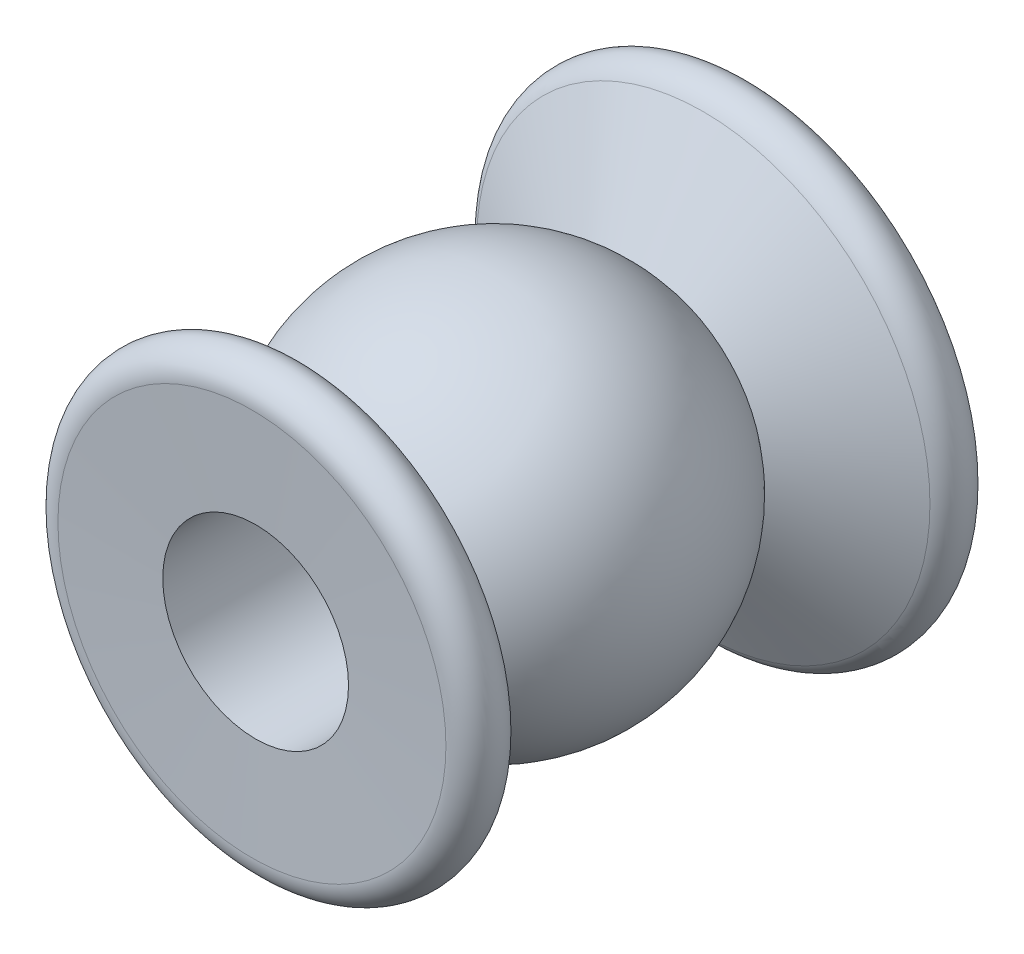
ISO-10303-21;
HEADER;
FILE_DESCRIPTION(('STEP AP214'),'2;1');
FILE_NAME('part.step','',(''),(''),'','','');
FILE_SCHEMA(('AUTOMOTIVE_DESIGN { 1 0 10303 214 1 1 1 1 }'));
ENDSEC;
DATA;
#1=APPLICATION_CONTEXT('core data for automotive mechanical design processes');
#2=APPLICATION_PROTOCOL_DEFINITION('international standard','automotive_design',2000,#1);
#3=PRODUCT_CONTEXT('',#1,'mechanical');
#4=PRODUCT('Part','Part','',(#3));
#5=PRODUCT_RELATED_PRODUCT_CATEGORY('part','',(#4));
#6=PRODUCT_DEFINITION_FORMATION('','',#4);
#7=PRODUCT_DEFINITION_CONTEXT('part definition',#1,'design');
#8=PRODUCT_DEFINITION('design','',#6,#7);
#9=PRODUCT_DEFINITION_SHAPE('','',#8);
#10=(LENGTH_UNIT() NAMED_UNIT(*) SI_UNIT(.MILLI.,.METRE.));
#11=(NAMED_UNIT(*) PLANE_ANGLE_UNIT() SI_UNIT($,.RADIAN.));
#12=(NAMED_UNIT(*) SI_UNIT($,.STERADIAN.) SOLID_ANGLE_UNIT());
#13=UNCERTAINTY_MEASURE_WITH_UNIT(LENGTH_MEASURE(1.E-05),#10,'distance_accuracy_value','');
#14=(GEOMETRIC_REPRESENTATION_CONTEXT(3) GLOBAL_UNCERTAINTY_ASSIGNED_CONTEXT((#13)) GLOBAL_UNIT_ASSIGNED_CONTEXT((#10,
#11,#12)) REPRESENTATION_CONTEXT('',''));
#15=CARTESIAN_POINT('',(0.,0.,0.));
#16=DIRECTION('',(0.,0.,1.));
#17=DIRECTION('',(1.,0.,0.));
#18=AXIS2_PLACEMENT_3D('',#15,#16,#17);
#19=CARTESIAN_POINT('',(0.,0.,-9.76374104308214));
#20=DIRECTION('',(0.,0.,-1.));
#21=DIRECTION('',(-1.,0.,0.));
#22=AXIS2_PLACEMENT_3D('',#19,#20,#21);
#23=CONICAL_SURFACE('',#22,7.9473037405945,1.45595489999742);
#24=CARTESIAN_POINT('',(0.,0.,-9.76374104308214));
#25=DIRECTION('',(0.,0.,1.));
#26=DIRECTION('',(1.,0.,0.));
#27=AXIS2_PLACEMENT_3D('',#24,#25,#26);
#28=CIRCLE('',#27,7.9473037405945);
#29=CARTESIAN_POINT('',(7.9473037405945,0.,-9.76374104308214));
#30=VERTEX_POINT('',#29);
#31=EDGE_CURVE('E12',#30,#30,#28,.T.);
#32=ORIENTED_EDGE('',*,*,#31,.F.);
#33=EDGE_LOOP('',(#32));
#34=FACE_BOUND('',#33,.T.);
#35=CARTESIAN_POINT('',(0.,0.,-9.25074914375167));
#36=DIRECTION('',(0.,0.,-1.));
#37=DIRECTION('',(-1.,0.,0.));
#38=AXIS2_PLACEMENT_3D('',#35,#36,#37);
#39=CIRCLE('',#38,3.5);
#40=CARTESIAN_POINT('',(-3.5,0.,-9.25074914375167));
#41=VERTEX_POINT('',#40);
#42=EDGE_CURVE('E76',#41,#41,#39,.F.);
#43=ORIENTED_EDGE('',*,*,#42,.T.);
#44=EDGE_LOOP('',(#43));
#45=FACE_BOUND('',#44,.T.);
#46=ADVANCED_FACE('F51',(#34,#45),#23,.F.);
#47=CARTESIAN_POINT('',(0.,0.,8.84702775380752));
#48=DIRECTION('',(0.,0.,1.));
#49=DIRECTION('',(1.,0.,0.));
#50=AXIS2_PLACEMENT_3D('',#47,#48,#49);
#51=CONICAL_SURFACE('',#50,0.,1.53417143502492);
#52=CARTESIAN_POINT('',(0.,0.,9.11489896326883));
#53=DIRECTION('',(0.,0.,1.));
#54=DIRECTION('',(1.,0.,0.));
#55=AXIS2_PLACEMENT_3D('',#52,#53,#54);
#56=CIRCLE('',#55,7.31064074752768);
#57=CARTESIAN_POINT('',(7.31064074752768,0.,9.11489896326883));
#58=VERTEX_POINT('',#57);
#59=EDGE_CURVE('E73',#58,#58,#56,.T.);
#60=ORIENTED_EDGE('',*,*,#59,.T.);
#61=EDGE_LOOP('',(#60));
#62=FACE_BOUND('',#61,.T.);
#63=CARTESIAN_POINT('',(0.,0.,8.97527222176769));
#64=DIRECTION('',(0.,0.,1.));
#65=DIRECTION('',(1.,0.,0.));
#66=AXIS2_PLACEMENT_3D('',#63,#64,#65);
#67=CIRCLE('',#66,3.5);
#68=CARTESIAN_POINT('',(3.5,0.,8.97527222176769));
#69=VERTEX_POINT('',#68);
#70=EDGE_CURVE('E54',#69,#69,#67,.F.);
#71=ORIENTED_EDGE('',*,*,#70,.T.);
#72=EDGE_LOOP('',(#71));
#73=FACE_BOUND('',#72,.T.);
#74=ADVANCED_FACE('F83',(#62,#73),#51,.F.);
#75=CARTESIAN_POINT('',(0.,0.,-8.77032807550783));
#76=DIRECTION('',(0.,0.,1.));
#77=DIRECTION('',(1.,0.,0.));
#78=AXIS2_PLACEMENT_3D('',#75,#76,#77);
#79=TOROIDAL_SURFACE('',#78,8.06189290175383,1.);
#80=ORIENTED_EDGE('',*,*,#31,.T.);
#81=EDGE_LOOP('',(#80));
#82=FACE_BOUND('',#81,.T.);
#83=CARTESIAN_POINT('',(0.,0.,-7.89325821524805));
#84=DIRECTION('',(0.,0.,1.));
#85=DIRECTION('',(1.,0.,0.));
#86=AXIS2_PLACEMENT_3D('',#83,#84,#85);
#87=CIRCLE('',#86,8.5422557440136);
#88=CARTESIAN_POINT('',(8.5422557440136,0.,-7.89325821524805));
#89=VERTEX_POINT('',#88);
#90=EDGE_CURVE('E58',#89,#89,#87,.T.);
#91=ORIENTED_EDGE('',*,*,#90,.F.);
#92=EDGE_LOOP('',(#91));
#93=FACE_BOUND('',#92,.T.);
#94=ADVANCED_FACE('F102',(#82,#93),#79,.T.);
#95=CARTESIAN_POINT('',(0.,0.,-5.66422685879253));
#96=DIRECTION('',(0.,0.,-1.));
#97=DIRECTION('',(-1.,0.,0.));
#98=AXIS2_PLACEMENT_3D('',#95,#96,#97);
#99=CONICAL_SURFACE('',#98,4.47238178972498,1.06972796299294);
#100=ORIENTED_EDGE('',*,*,#90,.T.);
#101=EDGE_LOOP('',(#100));
#102=FACE_BOUND('',#101,.T.);
#103=CARTESIAN_POINT('',(0.,0.,-5.66422685879253));
#104=DIRECTION('',(0.,0.,1.));
#105=DIRECTION('',(1.,0.,0.));
#106=AXIS2_PLACEMENT_3D('',#103,#104,#105);
#107=CIRCLE('',#106,4.47238178972498);
#108=CARTESIAN_POINT('',(4.47238178972498,0.,-5.66422685879253));
#109=VERTEX_POINT('',#108);
#110=EDGE_CURVE('E62',#109,#109,#107,.T.);
#111=ORIENTED_EDGE('',*,*,#110,.F.);
#112=EDGE_LOOP('',(#111));
#113=FACE_BOUND('',#112,.T.);
#114=ADVANCED_FACE('F107',(#102,#113),#99,.T.);
#115=CARTESIAN_POINT('',(0.,0.,0.));
#116=DIRECTION('',(0.,0.,1.));
#117=DIRECTION('',(1.,0.,0.));
#118=AXIS2_PLACEMENT_3D('',#115,#116,#117);
#119=SPHERICAL_SURFACE('',#118,7.21703989049044);
#120=CARTESIAN_POINT('',(0.,0.,5.66422685879253));
#121=DIRECTION('',(0.,0.,1.));
#122=DIRECTION('',(1.,0.,0.));
#123=AXIS2_PLACEMENT_3D('',#120,#121,#122);
#124=CIRCLE('',#123,4.47238178972498);
#125=CARTESIAN_POINT('',(4.47238178972498,0.,5.66422685879253));
#126=VERTEX_POINT('',#125);
#127=EDGE_CURVE('E67',#126,#126,#124,.T.);
#128=CARTESIAN_POINT('',(4.47238178972498,0.,-5.66422685879253));
#129=CARTESIAN_POINT('',(4.57887675765777,0.,-5.58014571803071));
#130=CARTESIAN_POINT('',(4.68299479389537,0.,-5.49305490580676));
#131=CARTESIAN_POINT('',(4.88615858956199,0.,-5.31314528887719));
#132=CARTESIAN_POINT('',(4.98520434899101,0.,-5.22032648417158));
#133=CARTESIAN_POINT('',(5.17790517762229,0.,-5.02925223272128));
#134=CARTESIAN_POINT('',(5.27156024682455,0.,-4.9309967859766));
#135=CARTESIAN_POINT('',(5.45318274860404,0.,-4.72936277284556));
#136=CARTESIAN_POINT('',(5.54115018118126,0.,-4.62598420645921));
#137=CARTESIAN_POINT('',(5.71111739401435,0.,-4.41443246203139));
#138=CARTESIAN_POINT('',(5.79311717427022,0.,-4.30625928398993));
#139=CARTESIAN_POINT('',(5.9508883565815,0.,-4.08546242344564));
#140=CARTESIAN_POINT('',(6.02665975863693,0.,-3.97283874094282));
#141=CARTESIAN_POINT('',(6.17173318419777,0.,-3.74349903911334));
#142=CARTESIAN_POINT('',(6.24103520770319,0.,-3.62678301978669));
#143=CARTESIAN_POINT('',(6.37294947325716,0.,-3.38962985234525));
#144=CARTESIAN_POINT('',(6.43556171530572,0.,-3.26919270423047));
#145=CARTESIAN_POINT('',(6.55389728519761,0.,-3.02498031515533));
#146=CARTESIAN_POINT('',(6.60962061304093,0.,-2.90120507419497));
#147=CARTESIAN_POINT('',(6.71400113282278,0.,-2.65071015362226));
#148=CARTESIAN_POINT('',(6.76265832476129,0.,-2.52399047400991));
#149=CARTESIAN_POINT('',(6.85275182368886,0.,-2.26800969431247));
#150=CARTESIAN_POINT('',(6.89418813067792,0.,-2.13874859422738));
#151=CARTESIAN_POINT('',(6.96970807602298,0.,-1.87809607460729));
#152=CARTESIAN_POINT('',(7.003791714379,0.,-1.7467046550723));
#153=CARTESIAN_POINT('',(7.06449792311366,0.,-1.48220937279186));
#154=CARTESIAN_POINT('',(7.0911204934923,0.,-1.34910551004641));
#155=CARTESIAN_POINT('',(7.1368198960586,0.,-1.08160866383488));
#156=CARTESIAN_POINT('',(7.15589672824624,0.,-0.947215680368793));
#157=CARTESIAN_POINT('',(7.18644398262165,0.,-0.677568015112783));
#158=CARTESIAN_POINT('',(7.1979144048094,0.,-0.542313333322862));
#159=CARTESIAN_POINT('',(7.2132123587438,0.,-0.271372434355294));
#160=CARTESIAN_POINT('',(7.21703989049044,0.,-0.135686217177646));
#161=CARTESIAN_POINT('',(7.21703989049044,0.,0.135686217177648));
#162=CARTESIAN_POINT('',(7.2132123587438,0.,0.271372434355295));
#163=CARTESIAN_POINT('',(7.1979144048094,0.,0.542313333322863));
#164=CARTESIAN_POINT('',(7.18644398262165,0.,0.677568015112785));
#165=CARTESIAN_POINT('',(7.15589672824624,0.,0.947215680368793));
#166=CARTESIAN_POINT('',(7.1368198960586,0.,1.08160866383488));
#167=CARTESIAN_POINT('',(7.0911204934923,0.,1.34910551004641));
#168=CARTESIAN_POINT('',(7.06449792311366,0.,1.48220937279186));
#169=CARTESIAN_POINT('',(7.003791714379,0.,1.7467046550723));
#170=CARTESIAN_POINT('',(6.96970807602298,0.,1.87809607460729));
#171=CARTESIAN_POINT('',(6.89418813067792,0.,2.13874859422738));
#172=CARTESIAN_POINT('',(6.85275182368886,0.,2.26800969431247));
#173=CARTESIAN_POINT('',(6.76265832476129,0.,2.52399047400991));
#174=CARTESIAN_POINT('',(6.71400113282277,0.,2.65071015362226));
#175=CARTESIAN_POINT('',(6.60962061304093,0.,2.90120507419497));
#176=CARTESIAN_POINT('',(6.55389728519761,0.,3.02498031515533));
#177=CARTESIAN_POINT('',(6.43556171530572,0.,3.26919270423047));
#178=CARTESIAN_POINT('',(6.37294947325716,0.,3.38962985234525));
#179=CARTESIAN_POINT('',(6.24103520770319,0.,3.62678301978669));
#180=CARTESIAN_POINT('',(6.17173318419777,0.,3.74349903911334));
#181=CARTESIAN_POINT('',(6.02665975863693,0.,3.97283874094282));
#182=CARTESIAN_POINT('',(5.9508883565815,0.,4.08546242344564));
#183=CARTESIAN_POINT('',(5.79311717427022,0.,4.30625928398993));
#184=CARTESIAN_POINT('',(5.71111739401435,0.,4.41443246203139));
#185=CARTESIAN_POINT('',(5.54115018118126,0.,4.62598420645921));
#186=CARTESIAN_POINT('',(5.45318274860403,0.,4.72936277284556));
#187=CARTESIAN_POINT('',(5.27156024682455,0.,4.9309967859766));
#188=CARTESIAN_POINT('',(5.17790517762229,0.,5.02925223272128));
#189=CARTESIAN_POINT('',(4.98520434899101,0.,5.22032648417158));
#190=CARTESIAN_POINT('',(4.88615858956199,0.,5.3131452888772));
#191=CARTESIAN_POINT('',(4.68299479389537,0.,5.49305490580676));
#192=CARTESIAN_POINT('',(4.57887675765777,0.,5.58014571803071));
#193=CARTESIAN_POINT('',(4.47238178972498,0.,5.66422685879253));
#194=B_SPLINE_CURVE_WITH_KNOTS('',3,(#128,#129,#130,#131,#132,#133,#134,#135,#136,#137,#138,
#139,#140,#141,#142,#143,#144,#145,#146,#147,#148,#149,#150,#151,#152,#153,#154,#155,#156,#157,
#158,#159,#160,#161,#162,#163,#164,#165,#166,#167,#168,#169,#170,#171,#172,#173,#174,#175,#176,
#177,#178,#179,#180,#181,#182,#183,#184,#185,#186,#187,#188,#189,#190,#191,#192,#193),
.UNSPECIFIED.,.F.,.F.,(4,2,2,2,2,2,2,2,2,2,2,2,2,2,2,2,2,2,2,2,2,2,2,2,2,2,2,2,2,2,2,2,4),(0.,
0.407004720344563,0.814009440689128,1.22101416103369,1.62801888137826,2.03502360172282,
2.44202832206739,2.84903304241195,3.25603776275651,3.66304248310108,4.07004720344564,
4.47705192379021,4.88405664413477,5.29106136447933,5.6980660848239,6.10507080516846,
6.51207552551303,6.91908024585759,7.32608496620215,7.73308968654672,8.14009440689128,
8.54709912723585,8.95410384758041,9.36110856792498,9.76811328826954,10.1751180086141,
10.5821227289587,10.9891274493032,11.3961321696478,11.8031368899924,12.2101416103369,
12.6171463306815,13.0241510510261),.UNSPECIFIED.);
#195=EDGE_CURVE('BSEAM111',#109,#126,#194,.T.);
#196=ORIENTED_EDGE('',*,*,#110,.T.);
#197=ORIENTED_EDGE('',*,*,#127,.F.);
#198=ORIENTED_EDGE('',*,*,#195,.T.);
#199=ORIENTED_EDGE('',*,*,#195,.F.);
#200=EDGE_LOOP('',(#196,#198,#197,#199));
#201=FACE_BOUND('',#200,.T.);
#202=ADVANCED_FACE('F111',(#201),#119,.T.);
#203=CARTESIAN_POINT('',(0.,0.,7.21004024211526));
#204=DIRECTION('',(0.,0.,1.));
#205=DIRECTION('',(1.,0.,0.));
#206=AXIS2_PLACEMENT_3D('',#203,#204,#205);
#207=CONICAL_SURFACE('',#206,7.77154110562706,1.13262566801202);
#208=ORIENTED_EDGE('',*,*,#127,.T.);
#209=EDGE_LOOP('',(#208));
#210=FACE_BOUND('',#209,.T.);
#211=CARTESIAN_POINT('',(0.,0.,7.21004024211526));
#212=DIRECTION('',(0.,0.,1.));
#213=DIRECTION('',(1.,0.,0.));
#214=AXIS2_PLACEMENT_3D('',#211,#212,#213);
#215=CIRCLE('',#214,7.77154110562706);
#216=CARTESIAN_POINT('',(7.77154110562706,0.,7.21004024211526));
#217=VERTEX_POINT('',#216);
#218=EDGE_CURVE('E70',#217,#217,#215,.T.);
#219=ORIENTED_EDGE('',*,*,#218,.F.);
#220=EDGE_LOOP('',(#219));
#221=FACE_BOUND('',#220,.T.);
#222=ADVANCED_FACE('F93',(#210,#221),#207,.T.);
#223=CARTESIAN_POINT('',(0.,0.,8.11556957964962));
#224=DIRECTION('',(0.,0.,1.));
#225=DIRECTION('',(1.,0.,0.));
#226=AXIS2_PLACEMENT_3D('',#223,#224,#225);
#227=TOROIDAL_SURFACE('',#226,7.34725745184745,1.);
#228=ORIENTED_EDGE('',*,*,#218,.T.);
#229=EDGE_LOOP('',(#228));
#230=FACE_BOUND('',#229,.T.);
#231=ORIENTED_EDGE('',*,*,#59,.F.);
#232=EDGE_LOOP('',(#231));
#233=FACE_BOUND('',#232,.T.);
#234=ADVANCED_FACE('F87',(#230,#233),#227,.T.);
#235=CARTESIAN_POINT('',(0.,0.,14.2362589569179));
#236=DIRECTION('',(0.,0.,-1.));
#237=DIRECTION('',(-1.,0.,0.));
#238=AXIS2_PLACEMENT_3D('',#235,#236,#237);
#239=CYLINDRICAL_SURFACE('',#238,3.5);
#240=ORIENTED_EDGE('',*,*,#42,.F.);
#241=EDGE_LOOP('',(#240));
#242=FACE_BOUND('',#241,.T.);
#243=ORIENTED_EDGE('',*,*,#70,.F.);
#244=EDGE_LOOP('',(#243));
#245=FACE_BOUND('',#244,.T.);
#246=ADVANCED_FACE('F85',(#242,#245),#239,.F.);
#247=CLOSED_SHELL('',(#46,#74,#94,#114,#202,#222,#234,#246));
#248=MANIFOLD_SOLID_BREP('B2',#247);
#249=ADVANCED_BREP_SHAPE_REPRESENTATION('',(#18,#248),#14);
#250=SHAPE_DEFINITION_REPRESENTATION(#9,#249);
ENDSEC;
END-ISO-10303-21;
